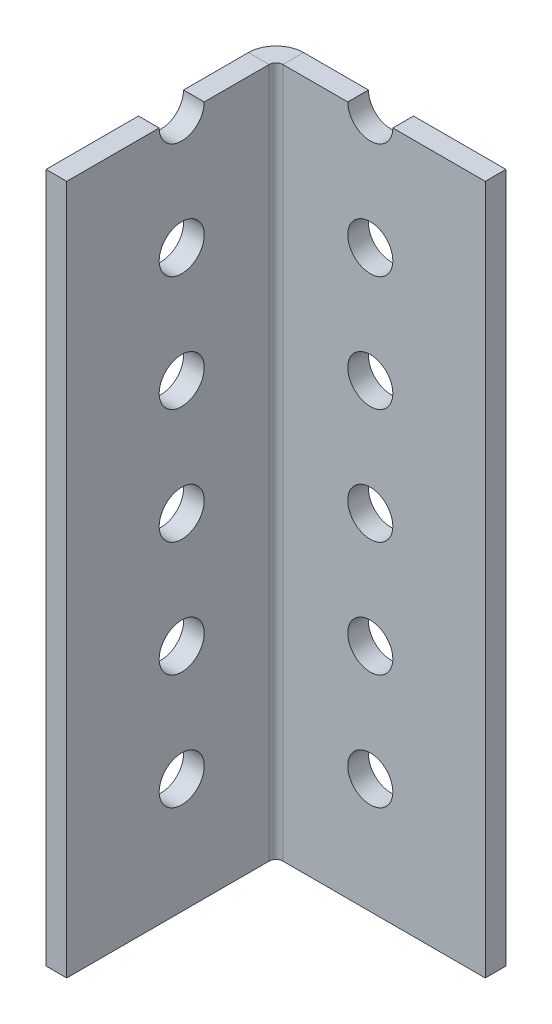
ISO-10303-21;
HEADER;
FILE_DESCRIPTION(('STEP AP214'),'2;1');
FILE_NAME('part.step','',(''),(''),'','','');
FILE_SCHEMA(('AUTOMOTIVE_DESIGN { 1 0 10303 214 1 1 1 1 }'));
ENDSEC;
DATA;
#1=APPLICATION_CONTEXT('core data for automotive mechanical design processes');
#2=APPLICATION_PROTOCOL_DEFINITION('international standard','automotive_design',2000,#1);
#3=PRODUCT_CONTEXT('',#1,'mechanical');
#4=PRODUCT('Part','Part','',(#3));
#5=PRODUCT_RELATED_PRODUCT_CATEGORY('part','',(#4));
#6=PRODUCT_DEFINITION_FORMATION('','',#4);
#7=PRODUCT_DEFINITION_CONTEXT('part definition',#1,'design');
#8=PRODUCT_DEFINITION('design','',#6,#7);
#9=PRODUCT_DEFINITION_SHAPE('','',#8);
#10=(LENGTH_UNIT() NAMED_UNIT(*) SI_UNIT(.MILLI.,.METRE.));
#11=(NAMED_UNIT(*) PLANE_ANGLE_UNIT() SI_UNIT($,.RADIAN.));
#12=(NAMED_UNIT(*) SI_UNIT($,.STERADIAN.) SOLID_ANGLE_UNIT());
#13=UNCERTAINTY_MEASURE_WITH_UNIT(LENGTH_MEASURE(1.E-05),#10,'distance_accuracy_value','');
#14=(GEOMETRIC_REPRESENTATION_CONTEXT(3) GLOBAL_UNCERTAINTY_ASSIGNED_CONTEXT((#13)) GLOBAL_UNIT_ASSIGNED_CONTEXT((#10,
#11,#12)) REPRESENTATION_CONTEXT('',''));
#15=CARTESIAN_POINT('',(0.,0.,0.));
#16=DIRECTION('',(0.,0.,1.));
#17=DIRECTION('',(1.,0.,0.));
#18=AXIS2_PLACEMENT_3D('',#15,#16,#17);
#19=CARTESIAN_POINT('',(0.,0.,18.8155418391894));
#20=DIRECTION('',(0.,1.,0.));
#21=DIRECTION('',(0.,0.,1.));
#22=AXIS2_PLACEMENT_3D('',#19,#20,#21);
#23=PLANE('',#22);
#24=DIRECTION('',(1.,0.,0.));
#25=VECTOR('',#24,1.);
#26=CARTESIAN_POINT('',(0.,0.,25.4));
#27=LINE('',#26,#25);
#28=CARTESIAN_POINT('',(0.,0.,25.4));
#29=VERTEX_POINT('',#28);
#30=CARTESIAN_POINT('',(2.286,0.,25.4));
#31=VERTEX_POINT('',#30);
#32=EDGE_CURVE('E11',#29,#31,#27,.T.);
#33=ORIENTED_EDGE('',*,*,#32,.F.);
#34=DIRECTION('',(0.,0.,1.));
#35=VECTOR('',#34,1.);
#36=CARTESIAN_POINT('',(0.,0.,18.8155418391894));
#37=LINE('',#36,#35);
#38=CARTESIAN_POINT('',(0.,0.,3.048));
#39=VERTEX_POINT('',#38);
#40=EDGE_CURVE('E81',#29,#39,#37,.F.);
#41=ORIENTED_EDGE('',*,*,#40,.T.);
#42=DIRECTION('',(-1.,0.,0.));
#43=VECTOR('',#42,1.);
#44=CARTESIAN_POINT('',(0.,0.,3.048));
#45=LINE('',#44,#43);
#46=CARTESIAN_POINT('',(2.286,0.,3.048));
#47=VERTEX_POINT('',#46);
#48=EDGE_CURVE('E28',#39,#47,#45,.F.);
#49=ORIENTED_EDGE('',*,*,#48,.T.);
#50=DIRECTION('',(0.,0.,-1.));
#51=VECTOR('',#50,1.);
#52=CARTESIAN_POINT('',(2.286,0.,18.8155418391894));
#53=LINE('',#52,#51);
#54=EDGE_CURVE('E248',#31,#47,#53,.T.);
#55=ORIENTED_EDGE('',*,*,#54,.F.);
#56=EDGE_LOOP('',(#33,#41,#49,#55));
#57=FACE_BOUND('',#56,.T.);
#58=ADVANCED_FACE('F17',(#57),#23,.F.);
#59=CARTESIAN_POINT('',(0.,76.2,18.8155418391894));
#60=DIRECTION('',(0.,1.,0.));
#61=DIRECTION('',(0.,0.,1.));
#62=AXIS2_PLACEMENT_3D('',#59,#60,#61);
#63=PLANE('',#62);
#64=DIRECTION('',(1.,0.,0.));
#65=VECTOR('',#64,1.);
#66=CARTESIAN_POINT('',(0.,76.2,3.048));
#67=LINE('',#66,#65);
#68=CARTESIAN_POINT('',(0.,76.2,3.048));
#69=VERTEX_POINT('',#68);
#70=CARTESIAN_POINT('',(2.286,76.2,3.048));
#71=VERTEX_POINT('',#70);
#72=EDGE_CURVE('E70',#69,#71,#67,.T.);
#73=ORIENTED_EDGE('',*,*,#72,.F.);
#74=DIRECTION('',(0.,0.,1.));
#75=VECTOR('',#74,1.);
#76=CARTESIAN_POINT('',(0.,76.2,18.8155418391894));
#77=LINE('',#76,#75);
#78=CARTESIAN_POINT('',(0.,76.2,10.2108));
#79=VERTEX_POINT('',#78);
#80=EDGE_CURVE('E84',#79,#69,#77,.F.);
#81=ORIENTED_EDGE('',*,*,#80,.F.);
#82=DIRECTION('',(1.,0.,0.));
#83=VECTOR('',#82,1.);
#84=CARTESIAN_POINT('',(0.,76.2,10.2108));
#85=LINE('',#84,#83);
#86=CARTESIAN_POINT('',(2.28599999999997,76.2,10.2108));
#87=VERTEX_POINT('',#86);
#88=EDGE_CURVE('E301',#79,#87,#85,.T.);
#89=ORIENTED_EDGE('',*,*,#88,.T.);
#90=DIRECTION('',(0.,0.,-1.));
#91=VECTOR('',#90,1.);
#92=CARTESIAN_POINT('',(2.286,76.2,18.8155418391894));
#93=LINE('',#92,#91);
#94=EDGE_CURVE('E244',#87,#71,#93,.T.);
#95=ORIENTED_EDGE('',*,*,#94,.T.);
#96=EDGE_LOOP('',(#73,#81,#89,#95));
#97=FACE_BOUND('',#96,.T.);
#98=ADVANCED_FACE('F382',(#97),#63,.T.);
#99=CARTESIAN_POINT('',(0.,76.2,12.7));
#100=DIRECTION('',(1.,0.,0.));
#101=DIRECTION('',(0.,0.,-1.));
#102=AXIS2_PLACEMENT_3D('',#99,#100,#101);
#103=CYLINDRICAL_SURFACE('',#102,2.4892);
#104=ORIENTED_EDGE('',*,*,#88,.F.);
#105=CARTESIAN_POINT('',(0.,76.2,12.7));
#106=DIRECTION('',(-1.,0.,0.));
#107=DIRECTION('',(0.,0.,1.));
#108=AXIS2_PLACEMENT_3D('',#105,#106,#107);
#109=CIRCLE('',#108,2.4892);
#110=CARTESIAN_POINT('',(0.,76.2,15.1892));
#111=VERTEX_POINT('',#110);
#112=EDGE_CURVE('E278',#79,#111,#109,.T.);
#113=ORIENTED_EDGE('',*,*,#112,.T.);
#114=DIRECTION('',(1.,0.,0.));
#115=VECTOR('',#114,1.);
#116=CARTESIAN_POINT('',(0.,76.2,15.1892));
#117=LINE('',#116,#115);
#118=CARTESIAN_POINT('',(2.28599999999997,76.2,15.1892));
#119=VERTEX_POINT('',#118);
#120=EDGE_CURVE('E37',#111,#119,#117,.T.);
#121=ORIENTED_EDGE('',*,*,#120,.T.);
#122=CARTESIAN_POINT('',(2.28599999999997,76.2,12.7));
#123=DIRECTION('',(-1.,0.,0.));
#124=DIRECTION('',(0.,0.,1.));
#125=AXIS2_PLACEMENT_3D('',#122,#123,#124);
#126=CIRCLE('',#125,2.4892);
#127=EDGE_CURVE('E239',#87,#119,#126,.T.);
#128=ORIENTED_EDGE('',*,*,#127,.F.);
#129=EDGE_LOOP('',(#104,#113,#121,#128));
#130=FACE_BOUND('',#129,.T.);
#131=ADVANCED_FACE('F386',(#130),#103,.F.);
#132=ORIENTED_EDGE('',*,*,#120,.F.);
#133=CARTESIAN_POINT('',(0.,76.2,25.4));
#134=VERTEX_POINT('',#133);
#135=EDGE_CURVE('E233',#134,#111,#77,.F.);
#136=ORIENTED_EDGE('',*,*,#135,.F.);
#137=DIRECTION('',(1.,0.,0.));
#138=VECTOR('',#137,1.);
#139=CARTESIAN_POINT('',(0.,76.2,25.4));
#140=LINE('',#139,#138);
#141=CARTESIAN_POINT('',(2.286,76.2,25.4));
#142=VERTEX_POINT('',#141);
#143=EDGE_CURVE('E273',#134,#142,#140,.T.);
#144=ORIENTED_EDGE('',*,*,#143,.T.);
#145=DIRECTION('',(0.,0.,-1.));
#146=VECTOR('',#145,1.);
#147=CARTESIAN_POINT('',(2.286,76.2,18.8155418391894));
#148=LINE('',#147,#146);
#149=EDGE_CURVE('E234',#142,#119,#148,.T.);
#150=ORIENTED_EDGE('',*,*,#149,.T.);
#151=EDGE_LOOP('',(#132,#136,#144,#150));
#152=FACE_BOUND('',#151,.T.);
#153=ADVANCED_FACE('F388',(#152),#63,.T.);
#154=CARTESIAN_POINT('',(0.,0.,25.4));
#155=DIRECTION('',(0.,0.,-1.));
#156=DIRECTION('',(0.,1.,0.));
#157=AXIS2_PLACEMENT_3D('',#154,#155,#156);
#158=PLANE('',#157);
#159=DIRECTION('',(0.,1.,0.));
#160=VECTOR('',#159,1.);
#161=CARTESIAN_POINT('',(0.,0.,25.4));
#162=LINE('',#161,#160);
#163=EDGE_CURVE('E95',#29,#134,#162,.T.);
#164=ORIENTED_EDGE('',*,*,#163,.F.);
#165=ORIENTED_EDGE('',*,*,#32,.T.);
#166=DIRECTION('',(0.,1.,0.));
#167=VECTOR('',#166,1.);
#168=CARTESIAN_POINT('',(2.286,0.,25.4));
#169=LINE('',#168,#167);
#170=EDGE_CURVE('E237',#31,#142,#169,.T.);
#171=ORIENTED_EDGE('',*,*,#170,.T.);
#172=ORIENTED_EDGE('',*,*,#143,.F.);
#173=EDGE_LOOP('',(#164,#165,#171,#172));
#174=FACE_BOUND('',#173,.T.);
#175=ADVANCED_FACE('F391',(#174),#158,.F.);
#176=CARTESIAN_POINT('',(0.,63.5,12.7));
#177=DIRECTION('',(1.,0.,0.));
#178=DIRECTION('',(0.,0.,-1.));
#179=AXIS2_PLACEMENT_3D('',#176,#177,#178);
#180=CYLINDRICAL_SURFACE('',#179,2.4892);
#181=CARTESIAN_POINT('',(2.28599999999997,63.5,12.7));
#182=DIRECTION('',(-1.,0.,0.));
#183=DIRECTION('',(0.,0.,1.));
#184=AXIS2_PLACEMENT_3D('',#181,#182,#183);
#185=CIRCLE('',#184,2.4892);
#186=CARTESIAN_POINT('',(2.28599999999996,63.5,15.1892));
#187=VERTEX_POINT('',#186);
#188=EDGE_CURVE('E243',#187,#187,#185,.T.);
#189=ORIENTED_EDGE('',*,*,#188,.F.);
#190=EDGE_LOOP('',(#189));
#191=FACE_BOUND('',#190,.T.);
#192=CARTESIAN_POINT('',(0.,63.5,12.7));
#193=DIRECTION('',(-1.,0.,0.));
#194=DIRECTION('',(0.,0.,1.));
#195=AXIS2_PLACEMENT_3D('',#192,#193,#194);
#196=CIRCLE('',#195,2.4892);
#197=CARTESIAN_POINT('',(0.,63.5,15.1892));
#198=VERTEX_POINT('',#197);
#199=EDGE_CURVE('E280',#198,#198,#196,.T.);
#200=ORIENTED_EDGE('',*,*,#199,.T.);
#201=EDGE_LOOP('',(#200));
#202=FACE_BOUND('',#201,.T.);
#203=ADVANCED_FACE('F394',(#191,#202),#180,.F.);
#204=CARTESIAN_POINT('',(0.,50.8,12.7));
#205=DIRECTION('',(1.,0.,0.));
#206=DIRECTION('',(0.,0.,-1.));
#207=AXIS2_PLACEMENT_3D('',#204,#205,#206);
#208=CYLINDRICAL_SURFACE('',#207,2.4892);
#209=CARTESIAN_POINT('',(2.28599999999997,50.8,12.7));
#210=DIRECTION('',(-1.,0.,0.));
#211=DIRECTION('',(0.,0.,1.));
#212=AXIS2_PLACEMENT_3D('',#209,#210,#211);
#213=CIRCLE('',#212,2.4892);
#214=CARTESIAN_POINT('',(2.28599999999996,50.8,15.1892));
#215=VERTEX_POINT('',#214);
#216=EDGE_CURVE('E257',#215,#215,#213,.T.);
#217=ORIENTED_EDGE('',*,*,#216,.F.);
#218=EDGE_LOOP('',(#217));
#219=FACE_BOUND('',#218,.T.);
#220=CARTESIAN_POINT('',(0.,50.8,12.7));
#221=DIRECTION('',(-1.,0.,0.));
#222=DIRECTION('',(0.,0.,1.));
#223=AXIS2_PLACEMENT_3D('',#220,#221,#222);
#224=CIRCLE('',#223,2.4892);
#225=CARTESIAN_POINT('',(0.,50.8,15.1892));
#226=VERTEX_POINT('',#225);
#227=EDGE_CURVE('E284',#226,#226,#224,.T.);
#228=ORIENTED_EDGE('',*,*,#227,.T.);
#229=EDGE_LOOP('',(#228));
#230=FACE_BOUND('',#229,.T.);
#231=ADVANCED_FACE('F398',(#219,#230),#208,.F.);
#232=CARTESIAN_POINT('',(0.,38.1,12.7));
#233=DIRECTION('',(1.,0.,0.));
#234=DIRECTION('',(0.,0.,-1.));
#235=AXIS2_PLACEMENT_3D('',#232,#233,#234);
#236=CYLINDRICAL_SURFACE('',#235,2.4892);
#237=CARTESIAN_POINT('',(2.28599999999997,38.1,12.7));
#238=DIRECTION('',(-1.,0.,0.));
#239=DIRECTION('',(0.,0.,1.));
#240=AXIS2_PLACEMENT_3D('',#237,#238,#239);
#241=CIRCLE('',#240,2.4892);
#242=CARTESIAN_POINT('',(2.28599999999996,38.1,15.1892));
#243=VERTEX_POINT('',#242);
#244=EDGE_CURVE('E261',#243,#243,#241,.T.);
#245=ORIENTED_EDGE('',*,*,#244,.F.);
#246=EDGE_LOOP('',(#245));
#247=FACE_BOUND('',#246,.T.);
#248=CARTESIAN_POINT('',(0.,38.1,12.7));
#249=DIRECTION('',(-1.,0.,0.));
#250=DIRECTION('',(0.,0.,1.));
#251=AXIS2_PLACEMENT_3D('',#248,#249,#250);
#252=CIRCLE('',#251,2.4892);
#253=CARTESIAN_POINT('',(0.,38.1,15.1892));
#254=VERTEX_POINT('',#253);
#255=EDGE_CURVE('E288',#254,#254,#252,.T.);
#256=ORIENTED_EDGE('',*,*,#255,.T.);
#257=EDGE_LOOP('',(#256));
#258=FACE_BOUND('',#257,.T.);
#259=ADVANCED_FACE('F402',(#247,#258),#236,.F.);
#260=CARTESIAN_POINT('',(0.,25.4,12.7));
#261=DIRECTION('',(1.,0.,0.));
#262=DIRECTION('',(0.,0.,-1.));
#263=AXIS2_PLACEMENT_3D('',#260,#261,#262);
#264=CYLINDRICAL_SURFACE('',#263,2.4892);
#265=CARTESIAN_POINT('',(2.28599999999997,25.4,12.7));
#266=DIRECTION('',(-1.,0.,0.));
#267=DIRECTION('',(0.,0.,1.));
#268=AXIS2_PLACEMENT_3D('',#265,#266,#267);
#269=CIRCLE('',#268,2.4892);
#270=CARTESIAN_POINT('',(2.28599999999996,25.4,15.1892));
#271=VERTEX_POINT('',#270);
#272=EDGE_CURVE('E265',#271,#271,#269,.T.);
#273=ORIENTED_EDGE('',*,*,#272,.F.);
#274=EDGE_LOOP('',(#273));
#275=FACE_BOUND('',#274,.T.);
#276=CARTESIAN_POINT('',(0.,25.4,12.7));
#277=DIRECTION('',(-1.,0.,0.));
#278=DIRECTION('',(0.,0.,1.));
#279=AXIS2_PLACEMENT_3D('',#276,#277,#278);
#280=CIRCLE('',#279,2.4892);
#281=CARTESIAN_POINT('',(0.,25.4,15.1892));
#282=VERTEX_POINT('',#281);
#283=EDGE_CURVE('E292',#282,#282,#280,.T.);
#284=ORIENTED_EDGE('',*,*,#283,.T.);
#285=EDGE_LOOP('',(#284));
#286=FACE_BOUND('',#285,.T.);
#287=ADVANCED_FACE('F405',(#275,#286),#264,.F.);
#288=CARTESIAN_POINT('',(0.,12.7,12.7));
#289=DIRECTION('',(1.,0.,0.));
#290=DIRECTION('',(0.,0.,-1.));
#291=AXIS2_PLACEMENT_3D('',#288,#289,#290);
#292=CYLINDRICAL_SURFACE('',#291,2.4892);
#293=CARTESIAN_POINT('',(2.28599999999997,12.7,12.7));
#294=DIRECTION('',(-1.,0.,0.));
#295=DIRECTION('',(0.,0.,1.));
#296=AXIS2_PLACEMENT_3D('',#293,#294,#295);
#297=CIRCLE('',#296,2.4892);
#298=CARTESIAN_POINT('',(2.28599999999996,12.7,15.1892));
#299=VERTEX_POINT('',#298);
#300=EDGE_CURVE('E269',#299,#299,#297,.T.);
#301=ORIENTED_EDGE('',*,*,#300,.F.);
#302=EDGE_LOOP('',(#301));
#303=FACE_BOUND('',#302,.T.);
#304=CARTESIAN_POINT('',(0.,12.7,12.7));
#305=DIRECTION('',(-1.,0.,0.));
#306=DIRECTION('',(0.,0.,1.));
#307=AXIS2_PLACEMENT_3D('',#304,#305,#306);
#308=CIRCLE('',#307,2.4892);
#309=CARTESIAN_POINT('',(0.,12.7,15.1892));
#310=VERTEX_POINT('',#309);
#311=EDGE_CURVE('E238',#310,#310,#308,.T.);
#312=ORIENTED_EDGE('',*,*,#311,.T.);
#313=EDGE_LOOP('',(#312));
#314=FACE_BOUND('',#313,.T.);
#315=ADVANCED_FACE('F19',(#303,#314),#292,.F.);
#316=CARTESIAN_POINT('',(2.286,0.,18.8155418391894));
#317=DIRECTION('',(1.,0.,0.));
#318=DIRECTION('',(0.,0.,-1.));
#319=AXIS2_PLACEMENT_3D('',#316,#317,#318);
#320=PLANE('',#319);
#321=ORIENTED_EDGE('',*,*,#149,.F.);
#322=ORIENTED_EDGE('',*,*,#170,.F.);
#323=ORIENTED_EDGE('',*,*,#54,.T.);
#324=DIRECTION('',(0.,1.,0.));
#325=VECTOR('',#324,1.);
#326=CARTESIAN_POINT('',(2.286,0.,3.048));
#327=LINE('',#326,#325);
#328=EDGE_CURVE('E247',#47,#71,#327,.T.);
#329=ORIENTED_EDGE('',*,*,#328,.T.);
#330=ORIENTED_EDGE('',*,*,#94,.F.);
#331=ORIENTED_EDGE('',*,*,#127,.T.);
#332=EDGE_LOOP('',(#321,#322,#323,#329,#330,#331));
#333=FACE_BOUND('',#332,.T.);
#334=ORIENTED_EDGE('',*,*,#188,.T.);
#335=EDGE_LOOP('',(#334));
#336=FACE_BOUND('',#335,.T.);
#337=ORIENTED_EDGE('',*,*,#216,.T.);
#338=EDGE_LOOP('',(#337));
#339=FACE_BOUND('',#338,.T.);
#340=ORIENTED_EDGE('',*,*,#244,.T.);
#341=EDGE_LOOP('',(#340));
#342=FACE_BOUND('',#341,.T.);
#343=ORIENTED_EDGE('',*,*,#272,.T.);
#344=EDGE_LOOP('',(#343));
#345=FACE_BOUND('',#344,.T.);
#346=ORIENTED_EDGE('',*,*,#300,.T.);
#347=EDGE_LOOP('',(#346));
#348=FACE_BOUND('',#347,.T.);
#349=ADVANCED_FACE('F411',(#333,#336,#339,#342,#345,#348),#320,.T.);
#350=CARTESIAN_POINT('',(0.,0.,18.8155418391894));
#351=DIRECTION('',(1.,0.,0.));
#352=DIRECTION('',(0.,0.,-1.));
#353=AXIS2_PLACEMENT_3D('',#350,#351,#352);
#354=PLANE('',#353);
#355=ORIENTED_EDGE('',*,*,#135,.T.);
#356=ORIENTED_EDGE('',*,*,#112,.F.);
#357=ORIENTED_EDGE('',*,*,#80,.T.);
#358=DIRECTION('',(0.,1.,0.));
#359=VECTOR('',#358,1.);
#360=CARTESIAN_POINT('',(0.,0.,3.048));
#361=LINE('',#360,#359);
#362=EDGE_CURVE('E21',#39,#69,#361,.T.);
#363=ORIENTED_EDGE('',*,*,#362,.F.);
#364=ORIENTED_EDGE('',*,*,#40,.F.);
#365=ORIENTED_EDGE('',*,*,#163,.T.);
#366=EDGE_LOOP('',(#355,#356,#357,#363,#364,#365));
#367=FACE_BOUND('',#366,.T.);
#368=ORIENTED_EDGE('',*,*,#199,.F.);
#369=EDGE_LOOP('',(#368));
#370=FACE_BOUND('',#369,.T.);
#371=ORIENTED_EDGE('',*,*,#227,.F.);
#372=EDGE_LOOP('',(#371));
#373=FACE_BOUND('',#372,.T.);
#374=ORIENTED_EDGE('',*,*,#255,.F.);
#375=EDGE_LOOP('',(#374));
#376=FACE_BOUND('',#375,.T.);
#377=ORIENTED_EDGE('',*,*,#283,.F.);
#378=EDGE_LOOP('',(#377));
#379=FACE_BOUND('',#378,.T.);
#380=ORIENTED_EDGE('',*,*,#311,.F.);
#381=EDGE_LOOP('',(#380));
#382=FACE_BOUND('',#381,.T.);
#383=ADVANCED_FACE('F78',(#367,#370,#373,#376,#379,#382),#354,.F.);
#384=CARTESIAN_POINT('',(15.3032662346959,0.,0.));
#385=DIRECTION('',(0.,-1.,0.));
#386=DIRECTION('',(1.,0.,0.));
#387=AXIS2_PLACEMENT_3D('',#384,#385,#386);
#388=PLANE('',#387);
#389=DIRECTION('',(0.,0.,-1.));
#390=VECTOR('',#389,1.);
#391=CARTESIAN_POINT('',(3.048,0.,0.));
#392=LINE('',#391,#390);
#393=CARTESIAN_POINT('',(3.048,0.,0.));
#394=VERTEX_POINT('',#393);
#395=CARTESIAN_POINT('',(3.048,0.,2.286));
#396=VERTEX_POINT('',#395);
#397=EDGE_CURVE('E222',#394,#396,#392,.F.);
#398=ORIENTED_EDGE('',*,*,#397,.F.);
#399=DIRECTION('',(1.,0.,0.));
#400=VECTOR('',#399,1.);
#401=CARTESIAN_POINT('',(15.3032662346959,0.,0.));
#402=LINE('',#401,#400);
#403=CARTESIAN_POINT('',(25.4,0.,0.));
#404=VERTEX_POINT('',#403);
#405=EDGE_CURVE('E179',#394,#404,#402,.T.);
#406=ORIENTED_EDGE('',*,*,#405,.T.);
#407=DIRECTION('',(0.,0.,1.));
#408=VECTOR('',#407,1.);
#409=CARTESIAN_POINT('',(25.4,0.,0.));
#410=LINE('',#409,#408);
#411=CARTESIAN_POINT('',(25.4,0.,2.286));
#412=VERTEX_POINT('',#411);
#413=EDGE_CURVE('E218',#404,#412,#410,.T.);
#414=ORIENTED_EDGE('',*,*,#413,.T.);
#415=DIRECTION('',(1.,0.,0.));
#416=VECTOR('',#415,1.);
#417=CARTESIAN_POINT('',(15.3032662346959,0.,2.286));
#418=LINE('',#417,#416);
#419=EDGE_CURVE('E151',#396,#412,#418,.T.);
#420=ORIENTED_EDGE('',*,*,#419,.F.);
#421=EDGE_LOOP('',(#398,#406,#414,#420));
#422=FACE_BOUND('',#421,.T.);
#423=ADVANCED_FACE('F332',(#422),#388,.T.);
#424=CARTESIAN_POINT('',(25.4,0.,0.));
#425=DIRECTION('',(1.,0.,0.));
#426=DIRECTION('',(0.,1.,0.));
#427=AXIS2_PLACEMENT_3D('',#424,#425,#426);
#428=PLANE('',#427);
#429=ORIENTED_EDGE('',*,*,#413,.F.);
#430=DIRECTION('',(0.,1.,0.));
#431=VECTOR('',#430,1.);
#432=CARTESIAN_POINT('',(25.4,0.,0.));
#433=LINE('',#432,#431);
#434=CARTESIAN_POINT('',(25.4,76.2,0.));
#435=VERTEX_POINT('',#434);
#436=EDGE_CURVE('E183',#404,#435,#433,.T.);
#437=ORIENTED_EDGE('',*,*,#436,.T.);
#438=DIRECTION('',(0.,0.,1.));
#439=VECTOR('',#438,1.);
#440=CARTESIAN_POINT('',(25.4,76.2,0.));
#441=LINE('',#440,#439);
#442=CARTESIAN_POINT('',(25.4,76.2,2.286));
#443=VERTEX_POINT('',#442);
#444=EDGE_CURVE('E214',#435,#443,#441,.T.);
#445=ORIENTED_EDGE('',*,*,#444,.T.);
#446=DIRECTION('',(0.,1.,0.));
#447=VECTOR('',#446,1.);
#448=CARTESIAN_POINT('',(25.4,0.,2.286));
#449=LINE('',#448,#447);
#450=EDGE_CURVE('E147',#412,#443,#449,.T.);
#451=ORIENTED_EDGE('',*,*,#450,.F.);
#452=EDGE_LOOP('',(#429,#437,#445,#451));
#453=FACE_BOUND('',#452,.T.);
#454=ADVANCED_FACE('F340',(#453),#428,.T.);
#455=CARTESIAN_POINT('',(15.3032662346959,76.2,0.));
#456=DIRECTION('',(0.,-1.,0.));
#457=DIRECTION('',(1.,0.,0.));
#458=AXIS2_PLACEMENT_3D('',#455,#456,#457);
#459=PLANE('',#458);
#460=ORIENTED_EDGE('',*,*,#444,.F.);
#461=DIRECTION('',(1.,0.,0.));
#462=VECTOR('',#461,1.);
#463=CARTESIAN_POINT('',(15.3032662346959,76.2,0.));
#464=LINE('',#463,#462);
#465=CARTESIAN_POINT('',(15.1892,76.2,0.));
#466=VERTEX_POINT('',#465);
#467=EDGE_CURVE('E178',#466,#435,#464,.T.);
#468=ORIENTED_EDGE('',*,*,#467,.F.);
#469=DIRECTION('',(0.,0.,1.));
#470=VECTOR('',#469,1.);
#471=CARTESIAN_POINT('',(15.1892,76.2,0.));
#472=LINE('',#471,#470);
#473=CARTESIAN_POINT('',(15.1892,76.2,2.286));
#474=VERTEX_POINT('',#473);
#475=EDGE_CURVE('E210',#466,#474,#472,.T.);
#476=ORIENTED_EDGE('',*,*,#475,.T.);
#477=DIRECTION('',(1.,0.,0.));
#478=VECTOR('',#477,1.);
#479=CARTESIAN_POINT('',(15.3032662346959,76.2,2.286));
#480=LINE('',#479,#478);
#481=EDGE_CURVE('E143',#474,#443,#480,.T.);
#482=ORIENTED_EDGE('',*,*,#481,.T.);
#483=EDGE_LOOP('',(#460,#468,#476,#482));
#484=FACE_BOUND('',#483,.T.);
#485=ADVANCED_FACE('F356',(#484),#459,.F.);
#486=CARTESIAN_POINT('',(12.7,76.2,0.));
#487=DIRECTION('',(0.,0.,1.));
#488=DIRECTION('',(1.,0.,0.));
#489=AXIS2_PLACEMENT_3D('',#486,#487,#488);
#490=CYLINDRICAL_SURFACE('',#489,2.4892);
#491=ORIENTED_EDGE('',*,*,#475,.F.);
#492=CARTESIAN_POINT('',(12.7,76.2,0.));
#493=DIRECTION('',(0.,0.,1.));
#494=DIRECTION('',(1.,0.,0.));
#495=AXIS2_PLACEMENT_3D('',#492,#493,#494);
#496=CIRCLE('',#495,2.4892);
#497=CARTESIAN_POINT('',(10.2108,76.2,0.));
#498=VERTEX_POINT('',#497);
#499=EDGE_CURVE('E187',#498,#466,#496,.T.);
#500=ORIENTED_EDGE('',*,*,#499,.F.);
#501=DIRECTION('',(0.,0.,1.));
#502=VECTOR('',#501,1.);
#503=CARTESIAN_POINT('',(10.2108,76.2,0.));
#504=LINE('',#503,#502);
#505=CARTESIAN_POINT('',(10.2108,76.2,2.286));
#506=VERTEX_POINT('',#505);
#507=EDGE_CURVE('E206',#498,#506,#504,.T.);
#508=ORIENTED_EDGE('',*,*,#507,.T.);
#509=CARTESIAN_POINT('',(12.7,76.2,2.286));
#510=DIRECTION('',(0.,0.,1.));
#511=DIRECTION('',(1.,0.,0.));
#512=AXIS2_PLACEMENT_3D('',#509,#510,#511);
#513=CIRCLE('',#512,2.4892);
#514=EDGE_CURVE('E139',#506,#474,#513,.T.);
#515=ORIENTED_EDGE('',*,*,#514,.T.);
#516=EDGE_LOOP('',(#491,#500,#508,#515));
#517=FACE_BOUND('',#516,.T.);
#518=ADVANCED_FACE('F371',(#517),#490,.F.);
#519=ORIENTED_EDGE('',*,*,#507,.F.);
#520=CARTESIAN_POINT('',(3.048,76.2,0.));
#521=VERTEX_POINT('',#520);
#522=EDGE_CURVE('E174',#521,#498,#464,.T.);
#523=ORIENTED_EDGE('',*,*,#522,.F.);
#524=DIRECTION('',(0.,0.,1.));
#525=VECTOR('',#524,1.);
#526=CARTESIAN_POINT('',(3.048,76.2,0.));
#527=LINE('',#526,#525);
#528=CARTESIAN_POINT('',(3.048,76.2,2.286));
#529=VERTEX_POINT('',#528);
#530=EDGE_CURVE('E170',#521,#529,#527,.T.);
#531=ORIENTED_EDGE('',*,*,#530,.T.);
#532=DIRECTION('',(1.,0.,0.));
#533=VECTOR('',#532,1.);
#534=CARTESIAN_POINT('',(15.3032662346959,76.2,2.286));
#535=LINE('',#534,#533);
#536=EDGE_CURVE('E133',#529,#506,#535,.T.);
#537=ORIENTED_EDGE('',*,*,#536,.T.);
#538=EDGE_LOOP('',(#519,#523,#531,#537));
#539=FACE_BOUND('',#538,.T.);
#540=ADVANCED_FACE('F370',(#539),#459,.F.);
#541=CARTESIAN_POINT('',(12.7,12.7,0.));
#542=DIRECTION('',(0.,0.,1.));
#543=DIRECTION('',(1.,0.,0.));
#544=AXIS2_PLACEMENT_3D('',#541,#542,#543);
#545=CYLINDRICAL_SURFACE('',#544,2.4892);
#546=CARTESIAN_POINT('',(12.7,12.7,2.286));
#547=DIRECTION('',(0.,0.,1.));
#548=DIRECTION('',(1.,0.,0.));
#549=AXIS2_PLACEMENT_3D('',#546,#547,#548);
#550=CIRCLE('',#549,2.4892);
#551=CARTESIAN_POINT('',(15.1892,12.7,2.286));
#552=VERTEX_POINT('',#551);
#553=EDGE_CURVE('E129',#552,#552,#550,.T.);
#554=ORIENTED_EDGE('',*,*,#553,.T.);
#555=EDGE_LOOP('',(#554));
#556=FACE_BOUND('',#555,.T.);
#557=CARTESIAN_POINT('',(12.7,12.7,0.));
#558=DIRECTION('',(0.,0.,1.));
#559=DIRECTION('',(1.,0.,0.));
#560=AXIS2_PLACEMENT_3D('',#557,#558,#559);
#561=CIRCLE('',#560,2.4892);
#562=CARTESIAN_POINT('',(15.1892,12.7,0.));
#563=VERTEX_POINT('',#562);
#564=EDGE_CURVE('E121',#563,#563,#561,.T.);
#565=ORIENTED_EDGE('',*,*,#564,.F.);
#566=EDGE_LOOP('',(#565));
#567=FACE_BOUND('',#566,.T.);
#568=ADVANCED_FACE('F378',(#556,#567),#545,.F.);
#569=CARTESIAN_POINT('',(12.7,25.4,0.));
#570=DIRECTION('',(0.,0.,1.));
#571=DIRECTION('',(1.,0.,0.));
#572=AXIS2_PLACEMENT_3D('',#569,#570,#571);
#573=CYLINDRICAL_SURFACE('',#572,2.4892);
#574=CARTESIAN_POINT('',(12.7,25.4,2.286));
#575=DIRECTION('',(0.,0.,1.));
#576=DIRECTION('',(1.,0.,0.));
#577=AXIS2_PLACEMENT_3D('',#574,#575,#576);
#578=CIRCLE('',#577,2.4892);
#579=CARTESIAN_POINT('',(15.1892,25.4,2.286));
#580=VERTEX_POINT('',#579);
#581=EDGE_CURVE('E142',#580,#580,#578,.T.);
#582=ORIENTED_EDGE('',*,*,#581,.T.);
#583=EDGE_LOOP('',(#582));
#584=FACE_BOUND('',#583,.T.);
#585=CARTESIAN_POINT('',(12.7,25.4,0.));
#586=DIRECTION('',(0.,0.,1.));
#587=DIRECTION('',(1.,0.,0.));
#588=AXIS2_PLACEMENT_3D('',#585,#586,#587);
#589=CIRCLE('',#588,2.4892);
#590=CARTESIAN_POINT('',(15.1892,25.4,0.));
#591=VERTEX_POINT('',#590);
#592=EDGE_CURVE('E191',#591,#591,#589,.T.);
#593=ORIENTED_EDGE('',*,*,#592,.F.);
#594=EDGE_LOOP('',(#593));
#595=FACE_BOUND('',#594,.T.);
#596=ADVANCED_FACE('F550',(#584,#595),#573,.F.);
#597=CARTESIAN_POINT('',(12.7,38.1,0.));
#598=DIRECTION('',(0.,0.,1.));
#599=DIRECTION('',(1.,0.,0.));
#600=AXIS2_PLACEMENT_3D('',#597,#598,#599);
#601=CYLINDRICAL_SURFACE('',#600,2.4892);
#602=CARTESIAN_POINT('',(12.7,38.1,2.286));
#603=DIRECTION('',(0.,0.,1.));
#604=DIRECTION('',(1.,0.,0.));
#605=AXIS2_PLACEMENT_3D('',#602,#603,#604);
#606=CIRCLE('',#605,2.4892);
#607=CARTESIAN_POINT('',(15.1892,38.1,2.286));
#608=VERTEX_POINT('',#607);
#609=EDGE_CURVE('E158',#608,#608,#606,.T.);
#610=ORIENTED_EDGE('',*,*,#609,.T.);
#611=EDGE_LOOP('',(#610));
#612=FACE_BOUND('',#611,.T.);
#613=CARTESIAN_POINT('',(12.7,38.1,0.));
#614=DIRECTION('',(0.,0.,1.));
#615=DIRECTION('',(1.,0.,0.));
#616=AXIS2_PLACEMENT_3D('',#613,#614,#615);
#617=CIRCLE('',#616,2.4892);
#618=CARTESIAN_POINT('',(15.1892,38.1,0.));
#619=VERTEX_POINT('',#618);
#620=EDGE_CURVE('E195',#619,#619,#617,.T.);
#621=ORIENTED_EDGE('',*,*,#620,.F.);
#622=EDGE_LOOP('',(#621));
#623=FACE_BOUND('',#622,.T.);
#624=ADVANCED_FACE('F559',(#612,#623),#601,.F.);
#625=CARTESIAN_POINT('',(12.7,50.8,0.));
#626=DIRECTION('',(0.,0.,1.));
#627=DIRECTION('',(1.,0.,0.));
#628=AXIS2_PLACEMENT_3D('',#625,#626,#627);
#629=CYLINDRICAL_SURFACE('',#628,2.4892);
#630=CARTESIAN_POINT('',(12.7,50.8,2.286));
#631=DIRECTION('',(0.,0.,1.));
#632=DIRECTION('',(1.,0.,0.));
#633=AXIS2_PLACEMENT_3D('',#630,#631,#632);
#634=CIRCLE('',#633,2.4892);
#635=CARTESIAN_POINT('',(15.1892,50.8,2.286));
#636=VERTEX_POINT('',#635);
#637=EDGE_CURVE('E162',#636,#636,#634,.T.);
#638=ORIENTED_EDGE('',*,*,#637,.T.);
#639=EDGE_LOOP('',(#638));
#640=FACE_BOUND('',#639,.T.);
#641=CARTESIAN_POINT('',(12.7,50.8,0.));
#642=DIRECTION('',(0.,0.,1.));
#643=DIRECTION('',(1.,0.,0.));
#644=AXIS2_PLACEMENT_3D('',#641,#642,#643);
#645=CIRCLE('',#644,2.4892);
#646=CARTESIAN_POINT('',(15.1892,50.8,0.));
#647=VERTEX_POINT('',#646);
#648=EDGE_CURVE('E199',#647,#647,#645,.T.);
#649=ORIENTED_EDGE('',*,*,#648,.F.);
#650=EDGE_LOOP('',(#649));
#651=FACE_BOUND('',#650,.T.);
#652=ADVANCED_FACE('F568',(#640,#651),#629,.F.);
#653=CARTESIAN_POINT('',(12.7,63.5,0.));
#654=DIRECTION('',(0.,0.,1.));
#655=DIRECTION('',(1.,0.,0.));
#656=AXIS2_PLACEMENT_3D('',#653,#654,#655);
#657=CYLINDRICAL_SURFACE('',#656,2.4892);
#658=CARTESIAN_POINT('',(12.7,63.5,2.286));
#659=DIRECTION('',(0.,0.,1.));
#660=DIRECTION('',(1.,0.,0.));
#661=AXIS2_PLACEMENT_3D('',#658,#659,#660);
#662=CIRCLE('',#661,2.4892);
#663=CARTESIAN_POINT('',(15.1892,63.5,2.286));
#664=VERTEX_POINT('',#663);
#665=EDGE_CURVE('E166',#664,#664,#662,.T.);
#666=ORIENTED_EDGE('',*,*,#665,.T.);
#667=EDGE_LOOP('',(#666));
#668=FACE_BOUND('',#667,.T.);
#669=CARTESIAN_POINT('',(12.7,63.5,0.));
#670=DIRECTION('',(0.,0.,1.));
#671=DIRECTION('',(1.,0.,0.));
#672=AXIS2_PLACEMENT_3D('',#669,#670,#671);
#673=CIRCLE('',#672,2.4892);
#674=CARTESIAN_POINT('',(15.1892,63.5,0.));
#675=VERTEX_POINT('',#674);
#676=EDGE_CURVE('E134',#675,#675,#673,.T.);
#677=ORIENTED_EDGE('',*,*,#676,.F.);
#678=EDGE_LOOP('',(#677));
#679=FACE_BOUND('',#678,.T.);
#680=ADVANCED_FACE('F577',(#668,#679),#657,.F.);
#681=CARTESIAN_POINT('',(15.3032662346959,0.,2.286));
#682=DIRECTION('',(0.,0.,1.));
#683=DIRECTION('',(1.,0.,0.));
#684=AXIS2_PLACEMENT_3D('',#681,#682,#683);
#685=PLANE('',#684);
#686=ORIENTED_EDGE('',*,*,#553,.F.);
#687=EDGE_LOOP('',(#686));
#688=FACE_BOUND('',#687,.T.);
#689=ORIENTED_EDGE('',*,*,#536,.F.);
#690=DIRECTION('',(0.,-1.,0.));
#691=VECTOR('',#690,1.);
#692=CARTESIAN_POINT('',(3.048,0.,2.286));
#693=LINE('',#692,#691);
#694=EDGE_CURVE('E138',#396,#529,#693,.F.);
#695=ORIENTED_EDGE('',*,*,#694,.F.);
#696=ORIENTED_EDGE('',*,*,#419,.T.);
#697=ORIENTED_EDGE('',*,*,#450,.T.);
#698=ORIENTED_EDGE('',*,*,#481,.F.);
#699=ORIENTED_EDGE('',*,*,#514,.F.);
#700=EDGE_LOOP('',(#689,#695,#696,#697,#698,#699));
#701=FACE_BOUND('',#700,.T.);
#702=ORIENTED_EDGE('',*,*,#581,.F.);
#703=EDGE_LOOP('',(#702));
#704=FACE_BOUND('',#703,.T.);
#705=ORIENTED_EDGE('',*,*,#609,.F.);
#706=EDGE_LOOP('',(#705));
#707=FACE_BOUND('',#706,.T.);
#708=ORIENTED_EDGE('',*,*,#637,.F.);
#709=EDGE_LOOP('',(#708));
#710=FACE_BOUND('',#709,.T.);
#711=ORIENTED_EDGE('',*,*,#665,.F.);
#712=EDGE_LOOP('',(#711));
#713=FACE_BOUND('',#712,.T.);
#714=ADVANCED_FACE('F325',(#688,#701,#704,#707,#710,#713),#685,.T.);
#715=CARTESIAN_POINT('',(15.3032662346959,0.,0.));
#716=DIRECTION('',(0.,0.,1.));
#717=DIRECTION('',(1.,0.,0.));
#718=AXIS2_PLACEMENT_3D('',#715,#716,#717);
#719=PLANE('',#718);
#720=ORIENTED_EDGE('',*,*,#564,.T.);
#721=EDGE_LOOP('',(#720));
#722=FACE_BOUND('',#721,.T.);
#723=ORIENTED_EDGE('',*,*,#522,.T.);
#724=ORIENTED_EDGE('',*,*,#499,.T.);
#725=ORIENTED_EDGE('',*,*,#467,.T.);
#726=ORIENTED_EDGE('',*,*,#436,.F.);
#727=ORIENTED_EDGE('',*,*,#405,.F.);
#728=DIRECTION('',(0.,-1.,0.));
#729=VECTOR('',#728,1.);
#730=CARTESIAN_POINT('',(3.048,0.,0.));
#731=LINE('',#730,#729);
#732=EDGE_CURVE('E111',#394,#521,#731,.F.);
#733=ORIENTED_EDGE('',*,*,#732,.T.);
#734=EDGE_LOOP('',(#723,#724,#725,#726,#727,#733));
#735=FACE_BOUND('',#734,.T.);
#736=ORIENTED_EDGE('',*,*,#592,.T.);
#737=EDGE_LOOP('',(#736));
#738=FACE_BOUND('',#737,.T.);
#739=ORIENTED_EDGE('',*,*,#620,.T.);
#740=EDGE_LOOP('',(#739));
#741=FACE_BOUND('',#740,.T.);
#742=ORIENTED_EDGE('',*,*,#648,.T.);
#743=EDGE_LOOP('',(#742));
#744=FACE_BOUND('',#743,.T.);
#745=ORIENTED_EDGE('',*,*,#676,.T.);
#746=EDGE_LOOP('',(#745));
#747=FACE_BOUND('',#746,.T.);
#748=ADVANCED_FACE('F345',(#722,#735,#738,#741,#744,#747),#719,.F.);
#749=CARTESIAN_POINT('',(3.048,76.2,3.048));
#750=DIRECTION('',(0.,-1.,0.));
#751=DIRECTION('',(0.,0.,-1.));
#752=AXIS2_PLACEMENT_3D('',#749,#750,#751);
#753=PLANE('',#752);
#754=ORIENTED_EDGE('',*,*,#72,.T.);
#755=CARTESIAN_POINT('',(3.048,76.2,3.048));
#756=DIRECTION('',(0.,1.,0.));
#757=DIRECTION('',(0.,0.,1.));
#758=AXIS2_PLACEMENT_3D('',#755,#756,#757);
#759=CIRCLE('',#758,0.762);
#760=EDGE_CURVE('E115',#529,#71,#759,.T.);
#761=ORIENTED_EDGE('',*,*,#760,.F.);
#762=ORIENTED_EDGE('',*,*,#530,.F.);
#763=CARTESIAN_POINT('',(3.048,76.2,3.048));
#764=DIRECTION('',(0.,1.,0.));
#765=DIRECTION('',(0.,0.,1.));
#766=AXIS2_PLACEMENT_3D('',#763,#764,#765);
#767=CIRCLE('',#766,3.048);
#768=EDGE_CURVE('E114',#521,#69,#767,.T.);
#769=ORIENTED_EDGE('',*,*,#768,.T.);
#770=EDGE_LOOP('',(#754,#761,#762,#769));
#771=FACE_BOUND('',#770,.T.);
#772=ADVANCED_FACE('F312',(#771),#753,.F.);
#773=CARTESIAN_POINT('',(3.048,0.,3.048));
#774=DIRECTION('',(0.,-1.,0.));
#775=DIRECTION('',(0.,0.,-1.));
#776=AXIS2_PLACEMENT_3D('',#773,#774,#775);
#777=PLANE('',#776);
#778=ORIENTED_EDGE('',*,*,#397,.T.);
#779=CARTESIAN_POINT('',(3.048,0.,3.048));
#780=DIRECTION('',(0.,1.,0.));
#781=DIRECTION('',(0.,0.,1.));
#782=AXIS2_PLACEMENT_3D('',#779,#780,#781);
#783=CIRCLE('',#782,0.762);
#784=EDGE_CURVE('E106',#396,#47,#783,.T.);
#785=ORIENTED_EDGE('',*,*,#784,.T.);
#786=ORIENTED_EDGE('',*,*,#48,.F.);
#787=CARTESIAN_POINT('',(3.048,0.,3.048));
#788=DIRECTION('',(0.,1.,0.));
#789=DIRECTION('',(0.,0.,1.));
#790=AXIS2_PLACEMENT_3D('',#787,#788,#789);
#791=CIRCLE('',#790,3.048);
#792=EDGE_CURVE('E103',#394,#39,#791,.T.);
#793=ORIENTED_EDGE('',*,*,#792,.F.);
#794=EDGE_LOOP('',(#778,#785,#786,#793));
#795=FACE_BOUND('',#794,.T.);
#796=ADVANCED_FACE('F101',(#795),#777,.T.);
#797=CARTESIAN_POINT('',(3.048,38.1,3.048));
#798=DIRECTION('',(0.,1.,0.));
#799=DIRECTION('',(-0.707106781186548,0.,-0.707106781186548));
#800=AXIS2_PLACEMENT_3D('',#797,#798,#799);
#801=CYLINDRICAL_SURFACE('',#800,3.048);
#802=ORIENTED_EDGE('',*,*,#792,.T.);
#803=ORIENTED_EDGE('',*,*,#362,.T.);
#804=ORIENTED_EDGE('',*,*,#768,.F.);
#805=ORIENTED_EDGE('',*,*,#732,.F.);
#806=EDGE_LOOP('',(#802,#803,#804,#805));
#807=FACE_BOUND('',#806,.T.);
#808=ADVANCED_FACE('F109',(#807),#801,.T.);
#809=CARTESIAN_POINT('',(3.048,38.1,3.048));
#810=DIRECTION('',(0.,1.,0.));
#811=DIRECTION('',(-0.707106781186548,0.,-0.707106781186548));
#812=AXIS2_PLACEMENT_3D('',#809,#810,#811);
#813=CYLINDRICAL_SURFACE('',#812,0.762);
#814=ORIENTED_EDGE('',*,*,#784,.F.);
#815=ORIENTED_EDGE('',*,*,#694,.T.);
#816=ORIENTED_EDGE('',*,*,#760,.T.);
#817=ORIENTED_EDGE('',*,*,#328,.F.);
#818=EDGE_LOOP('',(#814,#815,#816,#817));
#819=FACE_BOUND('',#818,.T.);
#820=ADVANCED_FACE('F318',(#819),#813,.F.);
#821=CLOSED_SHELL('',(#58,#98,#131,#153,#175,#203,#231,#259,#287,#315,#349,#383,#423,#454,#485,
#518,#540,#568,#596,#624,#652,#680,#714,#748,#772,#796,#808,#820));
#822=MANIFOLD_SOLID_BREP('B1',#821);
#823=ADVANCED_BREP_SHAPE_REPRESENTATION('',(#18,#822),#14);
#824=SHAPE_DEFINITION_REPRESENTATION(#9,#823);
ENDSEC;
END-ISO-10303-21;
